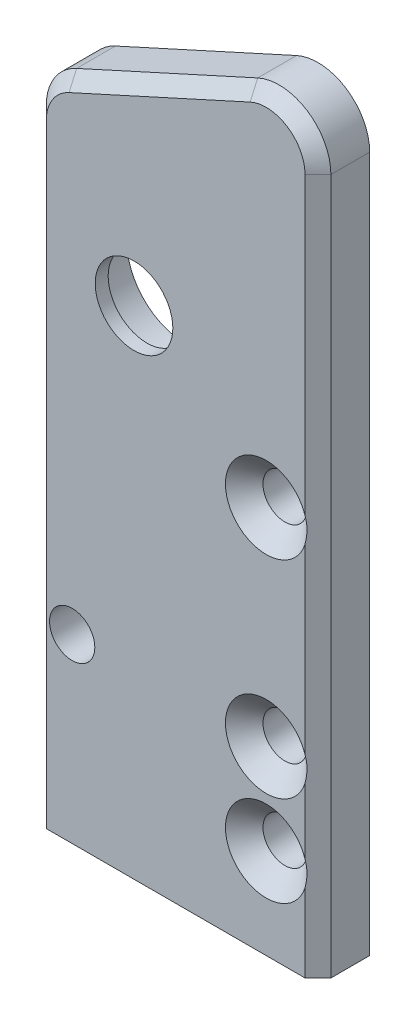
ISO-10303-21;
HEADER;
FILE_DESCRIPTION(('STEP AP214'),'2;1');
FILE_NAME('part.step','',(''),(''),'','','');
FILE_SCHEMA(('AUTOMOTIVE_DESIGN { 1 0 10303 214 1 1 1 1 }'));
ENDSEC;
DATA;
#1=APPLICATION_CONTEXT('core data for automotive mechanical design processes');
#2=APPLICATION_PROTOCOL_DEFINITION('international standard','automotive_design',2000,#1);
#3=PRODUCT_CONTEXT('',#1,'mechanical');
#4=PRODUCT('Part','Part','',(#3));
#5=PRODUCT_RELATED_PRODUCT_CATEGORY('part','',(#4));
#6=PRODUCT_DEFINITION_FORMATION('','',#4);
#7=PRODUCT_DEFINITION_CONTEXT('part definition',#1,'design');
#8=PRODUCT_DEFINITION('design','',#6,#7);
#9=PRODUCT_DEFINITION_SHAPE('','',#8);
#10=(LENGTH_UNIT() NAMED_UNIT(*) SI_UNIT(.MILLI.,.METRE.));
#11=(NAMED_UNIT(*) PLANE_ANGLE_UNIT() SI_UNIT($,.RADIAN.));
#12=(NAMED_UNIT(*) SI_UNIT($,.STERADIAN.) SOLID_ANGLE_UNIT());
#13=UNCERTAINTY_MEASURE_WITH_UNIT(LENGTH_MEASURE(1.E-05),#10,'distance_accuracy_value','');
#14=(GEOMETRIC_REPRESENTATION_CONTEXT(3) GLOBAL_UNCERTAINTY_ASSIGNED_CONTEXT((#13)) GLOBAL_UNIT_ASSIGNED_CONTEXT((#10,
#11,#12)) REPRESENTATION_CONTEXT('',''));
#15=CARTESIAN_POINT('',(0.,0.,0.));
#16=DIRECTION('',(0.,0.,1.));
#17=DIRECTION('',(1.,0.,0.));
#18=AXIS2_PLACEMENT_3D('',#15,#16,#17);
#19=CARTESIAN_POINT('',(7.78086952688254,38.3937133729587,4.));
#20=DIRECTION('',(0.,0.,1.));
#21=DIRECTION('',(1.,0.,0.));
#22=AXIS2_PLACEMENT_3D('',#19,#20,#21);
#23=CYLINDRICAL_SURFACE('',#22,3.);
#24=CARTESIAN_POINT('',(7.78086952688254,38.3937133729587,4.));
#25=DIRECTION('',(0.,0.,1.));
#26=DIRECTION('',(1.,0.,0.));
#27=AXIS2_PLACEMENT_3D('',#24,#25,#26);
#28=CIRCLE('',#27,3.);
#29=CARTESIAN_POINT('',(10.7808695268825,38.3937133729587,4.));
#30=VERTEX_POINT('',#29);
#31=EDGE_CURVE('E199',#30,#30,#28,.T.);
#32=ORIENTED_EDGE('',*,*,#31,.T.);
#33=EDGE_LOOP('',(#32));
#34=FACE_BOUND('',#33,.T.);
#35=CARTESIAN_POINT('',(7.78086952688254,38.3937133729587,3.));
#36=DIRECTION('',(0.,0.,-1.));
#37=DIRECTION('',(-1.,0.,0.));
#38=AXIS2_PLACEMENT_3D('',#35,#36,#37);
#39=CIRCLE('',#38,3.);
#40=CARTESIAN_POINT('',(4.78086952688254,38.3937133729587,3.));
#41=VERTEX_POINT('',#40);
#42=EDGE_CURVE('E46',#41,#41,#39,.F.);
#43=ORIENTED_EDGE('',*,*,#42,.F.);
#44=EDGE_LOOP('',(#43));
#45=FACE_BOUND('',#44,.T.);
#46=ADVANCED_FACE('F41',(#34,#45),#23,.F.);
#47=CARTESIAN_POINT('',(0.,50.,4.));
#48=DIRECTION('',(1.,0.,0.));
#49=DIRECTION('',(0.,1.,0.));
#50=AXIS2_PLACEMENT_3D('',#47,#48,#49);
#51=PLANE('',#50);
#52=DIRECTION('',(0.,0.,-1.));
#53=VECTOR('',#52,1.);
#54=CARTESIAN_POINT('',(0.,0.,4.));
#55=LINE('',#54,#53);
#56=CARTESIAN_POINT('',(0.,0.,2.99999999999999));
#57=VERTEX_POINT('',#56);
#58=CARTESIAN_POINT('',(0.,0.,0.));
#59=VERTEX_POINT('',#58);
#60=EDGE_CURVE('E323',#57,#59,#55,.T.);
#61=ORIENTED_EDGE('',*,*,#60,.F.);
#62=DIRECTION('',(0.,1.,0.));
#63=VECTOR('',#62,1.);
#64=CARTESIAN_POINT('',(0.,47.4243469186929,2.99999999999999));
#65=LINE('',#64,#63);
#66=CARTESIAN_POINT('',(0.,47.4243469186929,2.99999999999999));
#67=VERTEX_POINT('',#66);
#68=EDGE_CURVE('E192',#57,#67,#65,.T.);
#69=ORIENTED_EDGE('',*,*,#68,.T.);
#70=DIRECTION('',(0.,0.,-1.));
#71=VECTOR('',#70,1.);
#72=CARTESIAN_POINT('',(0.,47.4243469186929,4.));
#73=LINE('',#72,#71);
#74=CARTESIAN_POINT('',(0.,47.4243469186929,0.));
#75=VERTEX_POINT('',#74);
#76=EDGE_CURVE('E320',#67,#75,#73,.T.);
#77=ORIENTED_EDGE('',*,*,#76,.T.);
#78=DIRECTION('',(0.,-1.,0.));
#79=VECTOR('',#78,1.);
#80=CARTESIAN_POINT('',(0.,50.,0.));
#81=LINE('',#80,#79);
#82=EDGE_CURVE('E211',#75,#59,#81,.T.);
#83=ORIENTED_EDGE('',*,*,#82,.T.);
#84=EDGE_LOOP('',(#61,#69,#77,#83));
#85=FACE_BOUND('',#84,.T.);
#86=ADVANCED_FACE('F242',(#85),#51,.F.);
#87=CARTESIAN_POINT('',(0.,0.,4.));
#88=DIRECTION('',(0.,1.,0.));
#89=DIRECTION('',(0.,0.,1.));
#90=AXIS2_PLACEMENT_3D('',#87,#88,#89);
#91=PLANE('',#90);
#92=CARTESIAN_POINT('',(4.,0.,2.));
#93=DIRECTION('',(0.,-1.,0.));
#94=DIRECTION('',(0.,0.,-1.));
#95=AXIS2_PLACEMENT_3D('',#92,#93,#94);
#96=CIRCLE('',#95,0.799999999999999);
#97=CARTESIAN_POINT('',(4.,0.,1.2));
#98=VERTEX_POINT('',#97);
#99=EDGE_CURVE('E383',#98,#98,#96,.T.);
#100=ORIENTED_EDGE('',*,*,#99,.F.);
#101=EDGE_LOOP('',(#100));
#102=FACE_BOUND('',#101,.T.);
#103=CARTESIAN_POINT('',(12.,0.,2.));
#104=DIRECTION('',(0.,-1.,0.));
#105=DIRECTION('',(0.,0.,-1.));
#106=AXIS2_PLACEMENT_3D('',#103,#104,#105);
#107=CIRCLE('',#106,0.799999999999999);
#108=CARTESIAN_POINT('',(12.,0.,1.2));
#109=VERTEX_POINT('',#108);
#110=EDGE_CURVE('E375',#109,#109,#107,.T.);
#111=ORIENTED_EDGE('',*,*,#110,.F.);
#112=EDGE_LOOP('',(#111));
#113=FACE_BOUND('',#112,.T.);
#114=DIRECTION('',(0.,0.,-1.));
#115=VECTOR('',#114,1.);
#116=CARTESIAN_POINT('',(22.,0.,4.));
#117=LINE('',#116,#115);
#118=CARTESIAN_POINT('',(22.,0.,2.99999999999999));
#119=VERTEX_POINT('',#118);
#120=CARTESIAN_POINT('',(22.,0.,0.));
#121=VERTEX_POINT('',#120);
#122=EDGE_CURVE('E326',#119,#121,#117,.T.);
#123=ORIENTED_EDGE('',*,*,#122,.F.);
#124=DIRECTION('',(-0.707106781186545,0.,0.70710678118655));
#125=VECTOR('',#124,1.);
#126=CARTESIAN_POINT('',(21.,0.,4.));
#127=LINE('',#126,#125);
#128=CARTESIAN_POINT('',(21.,0.,4.));
#129=VERTEX_POINT('',#128);
#130=EDGE_CURVE('E178',#119,#129,#127,.T.);
#131=ORIENTED_EDGE('',*,*,#130,.T.);
#132=DIRECTION('',(1.,0.,0.));
#133=VECTOR('',#132,1.);
#134=CARTESIAN_POINT('',(0.,0.,4.));
#135=LINE('',#134,#133);
#136=CARTESIAN_POINT('',(1.,0.,4.));
#137=VERTEX_POINT('',#136);
#138=EDGE_CURVE('E329',#137,#129,#135,.T.);
#139=ORIENTED_EDGE('',*,*,#138,.F.);
#140=DIRECTION('',(-0.707106781186545,0.,-0.70710678118655));
#141=VECTOR('',#140,1.);
#142=CARTESIAN_POINT('',(1.,0.,4.));
#143=LINE('',#142,#141);
#144=EDGE_CURVE('E173',#137,#57,#143,.T.);
#145=ORIENTED_EDGE('',*,*,#144,.T.);
#146=ORIENTED_EDGE('',*,*,#60,.T.);
#147=DIRECTION('',(1.,0.,0.));
#148=VECTOR('',#147,1.);
#149=CARTESIAN_POINT('',(0.,0.,0.));
#150=LINE('',#149,#148);
#151=EDGE_CURVE('E337',#59,#121,#150,.T.);
#152=ORIENTED_EDGE('',*,*,#151,.T.);
#153=EDGE_LOOP('',(#123,#131,#139,#145,#146,#152));
#154=FACE_BOUND('',#153,.T.);
#155=ADVANCED_FACE('F259',(#102,#113,#154),#91,.F.);
#156=CARTESIAN_POINT('',(22.,0.,4.));
#157=DIRECTION('',(-1.,0.,0.));
#158=DIRECTION('',(0.,0.,1.));
#159=AXIS2_PLACEMENT_3D('',#156,#157,#158);
#160=PLANE('',#159);
#161=DIRECTION('',(0.,0.,-1.));
#162=VECTOR('',#161,1.);
#163=CARTESIAN_POINT('',(22.,53.7879832823292,4.));
#164=LINE('',#163,#162);
#165=CARTESIAN_POINT('',(22.,53.7879832823292,0.));
#166=VERTEX_POINT('',#165);
#167=CARTESIAN_POINT('',(22.,53.7879832823292,2.99999999999999));
#168=VERTEX_POINT('',#167);
#169=EDGE_CURVE('E308',#166,#168,#164,.F.);
#170=ORIENTED_EDGE('',*,*,#169,.T.);
#171=DIRECTION('',(0.,-1.,0.));
#172=VECTOR('',#171,1.);
#173=CARTESIAN_POINT('',(22.,0.,2.99999999999999));
#174=LINE('',#173,#172);
#175=EDGE_CURVE('E169',#168,#119,#174,.T.);
#176=ORIENTED_EDGE('',*,*,#175,.T.);
#177=ORIENTED_EDGE('',*,*,#122,.T.);
#178=DIRECTION('',(0.,1.,0.));
#179=VECTOR('',#178,1.);
#180=CARTESIAN_POINT('',(22.,0.,0.));
#181=LINE('',#180,#179);
#182=EDGE_CURVE('E333',#121,#166,#181,.T.);
#183=ORIENTED_EDGE('',*,*,#182,.T.);
#184=EDGE_LOOP('',(#170,#176,#177,#183));
#185=FACE_BOUND('',#184,.T.);
#186=ADVANCED_FACE('F255',(#185),#160,.F.);
#187=CARTESIAN_POINT('',(22.,60.,4.));
#188=DIRECTION('',(0.413802944301184,-0.910366477462605,0.));
#189=DIRECTION('',(0.910366477462605,0.413802944301184,0.));
#190=AXIS2_PLACEMENT_3D('',#187,#188,#189);
#191=PLANE('',#190);
#192=DIRECTION('',(0.,0.,-1.));
#193=VECTOR('',#192,1.);
#194=CARTESIAN_POINT('',(2.34478822279527,51.0658128285433,4.));
#195=LINE('',#194,#193);
#196=CARTESIAN_POINT('',(2.34478822279527,51.0658128285433,0.));
#197=VERTEX_POINT('',#196);
#198=CARTESIAN_POINT('',(2.34478822279527,51.0658128285433,2.99999999999999));
#199=VERTEX_POINT('',#198);
#200=EDGE_CURVE('E286',#197,#199,#195,.F.);
#201=ORIENTED_EDGE('',*,*,#200,.T.);
#202=DIRECTION('',(0.910366477462605,0.413802944301184,0.));
#203=VECTOR('',#202,1.);
#204=CARTESIAN_POINT('',(16.3447882227953,57.4294491921797,2.99999999999999));
#205=LINE('',#204,#203);
#206=CARTESIAN_POINT('',(16.3447882227953,57.4294491921797,2.99999999999999));
#207=VERTEX_POINT('',#206);
#208=EDGE_CURVE('E186',#199,#207,#205,.T.);
#209=ORIENTED_EDGE('',*,*,#208,.T.);
#210=DIRECTION('',(0.,0.,-1.));
#211=VECTOR('',#210,1.);
#212=CARTESIAN_POINT('',(16.3447882227953,57.4294491921797,4.));
#213=LINE('',#212,#211);
#214=CARTESIAN_POINT('',(16.3447882227953,57.4294491921797,0.));
#215=VERTEX_POINT('',#214);
#216=EDGE_CURVE('E278',#207,#215,#213,.T.);
#217=ORIENTED_EDGE('',*,*,#216,.T.);
#218=DIRECTION('',(-0.910366477462605,-0.413802944301184,0.));
#219=VECTOR('',#218,1.);
#220=CARTESIAN_POINT('',(22.,60.,0.));
#221=LINE('',#220,#219);
#222=EDGE_CURVE('E330',#215,#197,#221,.T.);
#223=ORIENTED_EDGE('',*,*,#222,.T.);
#224=EDGE_LOOP('',(#201,#209,#217,#223));
#225=FACE_BOUND('',#224,.T.);
#226=ADVANCED_FACE('F247',(#225),#191,.F.);
#227=CARTESIAN_POINT('',(0.,0.,4.));
#228=DIRECTION('',(0.,0.,1.));
#229=DIRECTION('',(1.,0.,0.));
#230=AXIS2_PLACEMENT_3D('',#227,#228,#229);
#231=PLANE('',#230);
#232=CARTESIAN_POINT('',(3.,14.,4.));
#233=DIRECTION('',(0.,0.,1.));
#234=DIRECTION('',(1.,0.,0.));
#235=AXIS2_PLACEMENT_3D('',#232,#233,#234);
#236=CIRCLE('',#235,1.75);
#237=CARTESIAN_POINT('',(4.75,14.,4.));
#238=VERTEX_POINT('',#237);
#239=EDGE_CURVE('E406',#238,#238,#236,.T.);
#240=ORIENTED_EDGE('',*,*,#239,.F.);
#241=EDGE_LOOP('',(#240));
#242=FACE_BOUND('',#241,.T.);
#243=CARTESIAN_POINT('',(18.,30.,4.));
#244=DIRECTION('',(0.,0.,1.));
#245=DIRECTION('',(1.,0.,0.));
#246=AXIS2_PLACEMENT_3D('',#243,#244,#245);
#247=CIRCLE('',#246,3.15);
#248=CARTESIAN_POINT('',(21.,30.9604686356149,4.));
#249=VERTEX_POINT('',#248);
#250=CARTESIAN_POINT('',(21.,29.0395313643851,4.));
#251=VERTEX_POINT('',#250);
#252=EDGE_CURVE('E57',#249,#251,#247,.T.);
#253=ORIENTED_EDGE('',*,*,#252,.F.);
#254=DIRECTION('',(0.,1.,0.));
#255=VECTOR('',#254,1.);
#256=CARTESIAN_POINT('',(21.,53.7879832823292,4.));
#257=LINE('',#256,#255);
#258=CARTESIAN_POINT('',(21.,53.7879832823292,4.));
#259=VERTEX_POINT('',#258);
#260=EDGE_CURVE('E144',#249,#259,#257,.T.);
#261=ORIENTED_EDGE('',*,*,#260,.T.);
#262=CARTESIAN_POINT('',(18.,53.7879832823292,4.));
#263=DIRECTION('',(0.,0.,1.));
#264=DIRECTION('',(1.,0.,0.));
#265=AXIS2_PLACEMENT_3D('',#262,#263,#264);
#266=CIRCLE('',#265,3.);
#267=CARTESIAN_POINT('',(16.7585911670964,56.5190827147171,4.));
#268=VERTEX_POINT('',#267);
#269=EDGE_CURVE('E157',#259,#268,#266,.T.);
#270=ORIENTED_EDGE('',*,*,#269,.T.);
#271=DIRECTION('',(-0.910366477462605,-0.413802944301184,0.));
#272=VECTOR('',#271,1.);
#273=CARTESIAN_POINT('',(2.75859116709645,50.1554463510807,4.));
#274=LINE('',#273,#272);
#275=CARTESIAN_POINT('',(2.75859116709645,50.1554463510807,4.));
#276=VERTEX_POINT('',#275);
#277=EDGE_CURVE('E163',#268,#276,#274,.T.);
#278=ORIENTED_EDGE('',*,*,#277,.T.);
#279=CARTESIAN_POINT('',(4.,47.4243469186929,4.));
#280=DIRECTION('',(0.,0.,1.));
#281=DIRECTION('',(1.,0.,0.));
#282=AXIS2_PLACEMENT_3D('',#279,#280,#281);
#283=CIRCLE('',#282,3.);
#284=CARTESIAN_POINT('',(1.,47.4243469186929,4.));
#285=VERTEX_POINT('',#284);
#286=EDGE_CURVE('E296',#276,#285,#283,.T.);
#287=ORIENTED_EDGE('',*,*,#286,.T.);
#288=DIRECTION('',(0.,-1.,0.));
#289=VECTOR('',#288,1.);
#290=CARTESIAN_POINT('',(1.,0.,4.));
#291=LINE('',#290,#289);
#292=EDGE_CURVE('E305',#285,#137,#291,.T.);
#293=ORIENTED_EDGE('',*,*,#292,.T.);
#294=ORIENTED_EDGE('',*,*,#138,.T.);
#295=CARTESIAN_POINT('',(21.,6.03953136438507,4.));
#296=VERTEX_POINT('',#295);
#297=EDGE_CURVE('E160',#129,#296,#257,.T.);
#298=ORIENTED_EDGE('',*,*,#297,.T.);
#299=CARTESIAN_POINT('',(18.,7.,4.));
#300=DIRECTION('',(0.,0.,1.));
#301=DIRECTION('',(1.,0.,0.));
#302=AXIS2_PLACEMENT_3D('',#299,#300,#301);
#303=CIRCLE('',#302,3.15);
#304=CARTESIAN_POINT('',(21.,7.96046863561493,4.));
#305=VERTEX_POINT('',#304);
#306=EDGE_CURVE('E64',#305,#296,#303,.T.);
#307=ORIENTED_EDGE('',*,*,#306,.F.);
#308=CARTESIAN_POINT('',(21.,13.0395313643851,4.));
#309=VERTEX_POINT('',#308);
#310=EDGE_CURVE('E159',#305,#309,#257,.T.);
#311=ORIENTED_EDGE('',*,*,#310,.T.);
#312=CARTESIAN_POINT('',(18.,14.,4.));
#313=DIRECTION('',(0.,0.,1.));
#314=DIRECTION('',(1.,0.,0.));
#315=AXIS2_PLACEMENT_3D('',#312,#313,#314);
#316=CIRCLE('',#315,3.15);
#317=CARTESIAN_POINT('',(21.,14.9604686356149,4.));
#318=VERTEX_POINT('',#317);
#319=EDGE_CURVE('E357',#318,#309,#316,.T.);
#320=ORIENTED_EDGE('',*,*,#319,.F.);
#321=EDGE_CURVE('E147',#318,#251,#257,.T.);
#322=ORIENTED_EDGE('',*,*,#321,.T.);
#323=EDGE_LOOP('',(#253,#261,#270,#278,#287,#293,#294,#298,#307,#311,#320,#322));
#324=FACE_BOUND('',#323,.T.);
#325=ORIENTED_EDGE('',*,*,#31,.F.);
#326=EDGE_LOOP('',(#325));
#327=FACE_BOUND('',#326,.T.);
#328=ADVANCED_FACE('F142',(#242,#324,#327),#231,.T.);
#329=CARTESIAN_POINT('',(0.,0.,0.));
#330=DIRECTION('',(0.,0.,1.));
#331=DIRECTION('',(1.,0.,0.));
#332=AXIS2_PLACEMENT_3D('',#329,#330,#331);
#333=PLANE('',#332);
#334=CARTESIAN_POINT('',(3.,14.,0.));
#335=DIRECTION('',(0.,0.,1.));
#336=DIRECTION('',(1.,0.,0.));
#337=AXIS2_PLACEMENT_3D('',#334,#335,#336);
#338=CIRCLE('',#337,1.75);
#339=CARTESIAN_POINT('',(4.75,14.,0.));
#340=VERTEX_POINT('',#339);
#341=EDGE_CURVE('E399',#340,#340,#338,.T.);
#342=ORIENTED_EDGE('',*,*,#341,.T.);
#343=EDGE_LOOP('',(#342));
#344=FACE_BOUND('',#343,.T.);
#345=CARTESIAN_POINT('',(7.78086952688254,38.3937133729587,0.));
#346=DIRECTION('',(0.,0.,-1.));
#347=DIRECTION('',(-1.,0.,0.));
#348=AXIS2_PLACEMENT_3D('',#345,#346,#347);
#349=CIRCLE('',#348,4.55);
#350=CARTESIAN_POINT('',(3.23086952688254,38.3937133729587,0.));
#351=VERTEX_POINT('',#350);
#352=EDGE_CURVE('E394',#351,#351,#349,.T.);
#353=ORIENTED_EDGE('',*,*,#352,.F.);
#354=EDGE_LOOP('',(#353));
#355=FACE_BOUND('',#354,.T.);
#356=CARTESIAN_POINT('',(18.,30.,0.));
#357=DIRECTION('',(0.,0.,1.));
#358=DIRECTION('',(1.,0.,0.));
#359=AXIS2_PLACEMENT_3D('',#356,#357,#358);
#360=CIRCLE('',#359,1.7);
#361=CARTESIAN_POINT('',(19.7,30.,0.));
#362=VERTEX_POINT('',#361);
#363=EDGE_CURVE('E387',#362,#362,#360,.T.);
#364=ORIENTED_EDGE('',*,*,#363,.T.);
#365=EDGE_LOOP('',(#364));
#366=FACE_BOUND('',#365,.T.);
#367=CARTESIAN_POINT('',(18.,7.,0.));
#368=DIRECTION('',(0.,0.,1.));
#369=DIRECTION('',(1.,0.,0.));
#370=AXIS2_PLACEMENT_3D('',#367,#368,#369);
#371=CIRCLE('',#370,1.7);
#372=CARTESIAN_POINT('',(19.7,7.,0.));
#373=VERTEX_POINT('',#372);
#374=EDGE_CURVE('E361',#373,#373,#371,.T.);
#375=ORIENTED_EDGE('',*,*,#374,.T.);
#376=EDGE_LOOP('',(#375));
#377=FACE_BOUND('',#376,.T.);
#378=CARTESIAN_POINT('',(18.,14.,0.));
#379=DIRECTION('',(0.,0.,1.));
#380=DIRECTION('',(1.,0.,0.));
#381=AXIS2_PLACEMENT_3D('',#378,#379,#380);
#382=CIRCLE('',#381,1.7);
#383=CARTESIAN_POINT('',(19.7,14.,0.));
#384=VERTEX_POINT('',#383);
#385=EDGE_CURVE('E349',#384,#384,#382,.T.);
#386=ORIENTED_EDGE('',*,*,#385,.T.);
#387=EDGE_LOOP('',(#386));
#388=FACE_BOUND('',#387,.T.);
#389=ORIENTED_EDGE('',*,*,#82,.F.);
#390=CARTESIAN_POINT('',(4.,47.4243469186929,0.));
#391=DIRECTION('',(0.,0.,1.));
#392=DIRECTION('',(1.,0.,0.));
#393=AXIS2_PLACEMENT_3D('',#390,#391,#392);
#394=CIRCLE('',#393,4.);
#395=EDGE_CURVE('E287',#75,#197,#394,.F.);
#396=ORIENTED_EDGE('',*,*,#395,.T.);
#397=ORIENTED_EDGE('',*,*,#222,.F.);
#398=CARTESIAN_POINT('',(18.,53.7879832823292,0.));
#399=DIRECTION('',(0.,0.,1.));
#400=DIRECTION('',(1.,0.,0.));
#401=AXIS2_PLACEMENT_3D('',#398,#399,#400);
#402=CIRCLE('',#401,4.);
#403=EDGE_CURVE('E282',#215,#166,#402,.F.);
#404=ORIENTED_EDGE('',*,*,#403,.T.);
#405=ORIENTED_EDGE('',*,*,#182,.F.);
#406=ORIENTED_EDGE('',*,*,#151,.F.);
#407=EDGE_LOOP('',(#389,#396,#397,#404,#405,#406));
#408=FACE_BOUND('',#407,.T.);
#409=ADVANCED_FACE('F246',(#344,#355,#366,#377,#388,#408),#333,.F.);
#410=CARTESIAN_POINT('',(4.,47.4243469186929,4.));
#411=DIRECTION('',(0.,0.,-1.));
#412=DIRECTION('',(-1.,0.,0.));
#413=AXIS2_PLACEMENT_3D('',#410,#411,#412);
#414=CYLINDRICAL_SURFACE('',#413,4.);
#415=ORIENTED_EDGE('',*,*,#76,.F.);
#416=CARTESIAN_POINT('',(4.,47.4243469186929,2.99999999999999));
#417=DIRECTION('',(0.,0.,1.));
#418=DIRECTION('',(1.,0.,0.));
#419=AXIS2_PLACEMENT_3D('',#416,#417,#418);
#420=CIRCLE('',#419,4.);
#421=EDGE_CURVE('E189',#67,#199,#420,.F.);
#422=ORIENTED_EDGE('',*,*,#421,.T.);
#423=ORIENTED_EDGE('',*,*,#200,.F.);
#424=ORIENTED_EDGE('',*,*,#395,.F.);
#425=EDGE_LOOP('',(#415,#422,#423,#424));
#426=FACE_BOUND('',#425,.T.);
#427=ADVANCED_FACE('F251',(#426),#414,.T.);
#428=CARTESIAN_POINT('',(18.,53.7879832823292,4.));
#429=DIRECTION('',(0.,0.,-1.));
#430=DIRECTION('',(-1.,0.,0.));
#431=AXIS2_PLACEMENT_3D('',#428,#429,#430);
#432=CYLINDRICAL_SURFACE('',#431,4.);
#433=ORIENTED_EDGE('',*,*,#216,.F.);
#434=CARTESIAN_POINT('',(18.,53.7879832823292,2.99999999999999));
#435=DIRECTION('',(0.,0.,1.));
#436=DIRECTION('',(1.,0.,0.));
#437=AXIS2_PLACEMENT_3D('',#434,#435,#436);
#438=CIRCLE('',#437,4.);
#439=EDGE_CURVE('E183',#207,#168,#438,.F.);
#440=ORIENTED_EDGE('',*,*,#439,.T.);
#441=ORIENTED_EDGE('',*,*,#169,.F.);
#442=ORIENTED_EDGE('',*,*,#403,.F.);
#443=EDGE_LOOP('',(#433,#440,#441,#442));
#444=FACE_BOUND('',#443,.T.);
#445=ADVANCED_FACE('F267',(#444),#432,.T.);
#446=CARTESIAN_POINT('',(1.,0.,4.));
#447=DIRECTION('',(-0.70710678118655,0.,0.707106781186545));
#448=DIRECTION('',(0.,1.,0.));
#449=AXIS2_PLACEMENT_3D('',#446,#447,#448);
#450=PLANE('',#449);
#451=ORIENTED_EDGE('',*,*,#144,.F.);
#452=ORIENTED_EDGE('',*,*,#292,.F.);
#453=DIRECTION('',(0.707106781186545,0.,0.70710678118655));
#454=VECTOR('',#453,1.);
#455=CARTESIAN_POINT('',(0.,47.4243469186929,2.99999999999999));
#456=LINE('',#455,#454);
#457=EDGE_CURVE('E207',#67,#285,#456,.T.);
#458=ORIENTED_EDGE('',*,*,#457,.F.);
#459=ORIENTED_EDGE('',*,*,#68,.F.);
#460=EDGE_LOOP('',(#451,#452,#458,#459));
#461=FACE_BOUND('',#460,.T.);
#462=ADVANCED_FACE('F44',(#461),#450,.T.);
#463=CARTESIAN_POINT('',(4.,47.4243469186929,4.));
#464=DIRECTION('',(0.,0.,-1.));
#465=DIRECTION('',(-1.,0.,0.));
#466=AXIS2_PLACEMENT_3D('',#463,#464,#465);
#467=CONICAL_SURFACE('',#466,3.,0.785398163397445);
#468=ORIENTED_EDGE('',*,*,#457,.T.);
#469=ORIENTED_EDGE('',*,*,#286,.F.);
#470=DIRECTION('',(0.292602867990325,-0.643726309578716,0.70710678118655));
#471=VECTOR('',#470,1.);
#472=CARTESIAN_POINT('',(2.34478822279527,51.0658128285433,2.99999999999999));
#473=LINE('',#472,#471);
#474=EDGE_CURVE('E203',#199,#276,#473,.T.);
#475=ORIENTED_EDGE('',*,*,#474,.F.);
#476=ORIENTED_EDGE('',*,*,#421,.F.);
#477=EDGE_LOOP('',(#468,#469,#475,#476));
#478=FACE_BOUND('',#477,.T.);
#479=ADVANCED_FACE('F274',(#478),#467,.T.);
#480=CARTESIAN_POINT('',(-18.421813494055,40.527989686921,4.));
#481=DIRECTION('',(-0.292602867990326,0.643726309578718,0.707106781186547));
#482=DIRECTION('',(0.910366477462605,0.413802944301184,0.));
#483=AXIS2_PLACEMENT_3D('',#480,#481,#482);
#484=PLANE('',#483);
#485=ORIENTED_EDGE('',*,*,#474,.T.);
#486=ORIENTED_EDGE('',*,*,#277,.F.);
#487=DIRECTION('',(0.292602867990326,-0.643726309578719,0.707106781186547));
#488=VECTOR('',#487,1.);
#489=CARTESIAN_POINT('',(16.3447882227953,57.4294491921797,2.99999999999999));
#490=LINE('',#489,#488);
#491=EDGE_CURVE('E198',#207,#268,#490,.T.);
#492=ORIENTED_EDGE('',*,*,#491,.F.);
#493=ORIENTED_EDGE('',*,*,#208,.F.);
#494=EDGE_LOOP('',(#485,#486,#492,#493));
#495=FACE_BOUND('',#494,.T.);
#496=ADVANCED_FACE('F292',(#495),#484,.T.);
#497=CARTESIAN_POINT('',(18.,53.7879832823292,4.));
#498=DIRECTION('',(0.,0.,-1.));
#499=DIRECTION('',(-1.,0.,0.));
#500=AXIS2_PLACEMENT_3D('',#497,#498,#499);
#501=CONICAL_SURFACE('',#500,3.,0.785398163397445);
#502=ORIENTED_EDGE('',*,*,#491,.T.);
#503=ORIENTED_EDGE('',*,*,#269,.F.);
#504=DIRECTION('',(-0.707106781186545,0.,0.70710678118655));
#505=VECTOR('',#504,1.);
#506=CARTESIAN_POINT('',(22.,53.7879832823292,2.99999999999999));
#507=LINE('',#506,#505);
#508=EDGE_CURVE('E154',#168,#259,#507,.T.);
#509=ORIENTED_EDGE('',*,*,#508,.F.);
#510=ORIENTED_EDGE('',*,*,#439,.F.);
#511=EDGE_LOOP('',(#502,#503,#509,#510));
#512=FACE_BOUND('',#511,.T.);
#513=ADVANCED_FACE('F294',(#512),#501,.T.);
#514=CARTESIAN_POINT('',(21.,0.,4.));
#515=DIRECTION('',(0.70710678118655,0.,0.707106781186545));
#516=DIRECTION('',(0.,-1.,0.));
#517=AXIS2_PLACEMENT_3D('',#514,#515,#516);
#518=PLANE('',#517);
#519=CARTESIAN_POINT('',(20.9998,29.038251592151,4.0002));
#520=CARTESIAN_POINT('',(21.0094598288719,29.1000168735679,3.99054017112806));
#521=CARTESIAN_POINT('',(21.0182296806067,29.1620545345121,3.98177031939328));
#522=CARTESIAN_POINT('',(21.0339377036715,29.2865969080283,3.96606229632847));
#523=CARTESIAN_POINT('',(21.0408757204833,29.3491016595431,3.9591242795167));
#524=CARTESIAN_POINT('',(21.0588655060921,29.5372189299875,3.9411344939079));
#525=CARTESIAN_POINT('',(21.0670876099148,29.6634002173136,3.93291239008519));
#526=CARTESIAN_POINT('',(21.0756519317253,29.9139743858808,3.92434806827473));
#527=CARTESIAN_POINT('',(21.0761349807796,30.0383579677483,3.92386501922042));
#528=CARTESIAN_POINT('',(21.0695708497944,30.2866598549277,3.93042915020556));
#529=CARTESIAN_POINT('',(21.0625286153051,30.4105784121721,3.93747138469494));
#530=CARTESIAN_POINT('',(21.0456109780022,30.6054996769846,3.95438902199784));
#531=CARTESIAN_POINT('',(21.0381550522407,30.6769419447855,3.96184494775925));
#532=CARTESIAN_POINT('',(21.0207993090742,30.8196284386953,3.97920069092582));
#533=CARTESIAN_POINT('',(21.0108865057673,30.8908695095365,3.98911349423269));
#534=CARTESIAN_POINT('',(20.9997999999999,30.9617484078498,4.00020000000012));
#535=B_SPLINE_CURVE_WITH_KNOTS('',3,(#519,#520,#521,#522,#523,#524,#525,#526,#527,#528,#529,
#530,#531,#532,#533,#534),.UNSPECIFIED.,.F.,.F.,(4,2,2,2,2,2,2,4),(0.,0.189747818518311,
0.379511637462911,0.759144204728139,1.13186041624852,1.5043318325143,1.72090674911368,
1.93865174773794),.UNSPECIFIED.);
#536=EDGE_CURVE('E11',#251,#249,#535,.T.);
#537=ORIENTED_EDGE('',*,*,#536,.F.);
#538=ORIENTED_EDGE('',*,*,#321,.F.);
#539=CARTESIAN_POINT('',(20.9998,13.038251592151,4.0002));
#540=CARTESIAN_POINT('',(21.0094598288719,13.1000168735679,3.99054017112806));
#541=CARTESIAN_POINT('',(21.0182296806067,13.1620545345121,3.98177031939328));
#542=CARTESIAN_POINT('',(21.0339377036715,13.2865969080283,3.96606229632848));
#543=CARTESIAN_POINT('',(21.0408757204833,13.3491016595431,3.9591242795167));
#544=CARTESIAN_POINT('',(21.0588655060921,13.5372189299875,3.9411344939079));
#545=CARTESIAN_POINT('',(21.0670876099148,13.6634002173136,3.93291239008519));
#546=CARTESIAN_POINT('',(21.0756519317253,13.9139743858809,3.92434806827473));
#547=CARTESIAN_POINT('',(21.0761349807796,14.0383579677483,3.92386501922042));
#548=CARTESIAN_POINT('',(21.0695708497944,14.2866598549277,3.93042915020556));
#549=CARTESIAN_POINT('',(21.0625286153051,14.4105784121721,3.93747138469494));
#550=CARTESIAN_POINT('',(21.0456109780022,14.6054996769845,3.95438902199783));
#551=CARTESIAN_POINT('',(21.0381550522408,14.6769419447853,3.96184494775923));
#552=CARTESIAN_POINT('',(21.0207993090742,14.8196284386948,3.97920069092576));
#553=CARTESIAN_POINT('',(21.0108865057674,14.890869509536,3.98911349423261));
#554=CARTESIAN_POINT('',(20.9998,14.9617484078491,4.00020000000002));
#555=B_SPLINE_CURVE_WITH_KNOTS('',3,(#539,#540,#541,#542,#543,#544,#545,#546,#547,#548,#549,
#550,#551,#552,#553,#554),.UNSPECIFIED.,.F.,.F.,(4,2,2,2,2,2,2,4),(0.,0.189747818518309,
0.379511637462907,0.759144204728137,1.13186041624852,1.50433183251431,1.72090674911334,
1.93865174773725),.UNSPECIFIED.);
#556=EDGE_CURVE('E195',#309,#318,#555,.T.);
#557=ORIENTED_EDGE('',*,*,#556,.F.);
#558=ORIENTED_EDGE('',*,*,#310,.F.);
#559=CARTESIAN_POINT('',(20.9998,6.03825159215105,4.0002));
#560=CARTESIAN_POINT('',(21.0094598288719,6.10001687356788,3.99054017112806));
#561=CARTESIAN_POINT('',(21.0182296806067,6.16205453451211,3.98177031939328));
#562=CARTESIAN_POINT('',(21.0339377036715,6.2865969080283,3.96606229632847));
#563=CARTESIAN_POINT('',(21.0408757204833,6.3491016595431,3.9591242795167));
#564=CARTESIAN_POINT('',(21.0588655060921,6.5372189299875,3.9411344939079));
#565=CARTESIAN_POINT('',(21.0670876099148,6.66340021731363,3.93291239008519));
#566=CARTESIAN_POINT('',(21.0756519317253,6.91397438588086,3.92434806827473));
#567=CARTESIAN_POINT('',(21.0761349807796,7.03835796774829,3.92386501922042));
#568=CARTESIAN_POINT('',(21.0695708497944,7.2866598549277,3.93042915020556));
#569=CARTESIAN_POINT('',(21.0625286153051,7.41057841217211,3.93747138469494));
#570=CARTESIAN_POINT('',(21.0456109780022,7.60549967698448,3.95438902199783));
#571=CARTESIAN_POINT('',(21.0381550522408,7.67694194478528,3.96184494775923));
#572=CARTESIAN_POINT('',(21.0207993090742,7.81962843869481,3.97920069092576));
#573=CARTESIAN_POINT('',(21.0108865057674,7.89086950953598,3.98911349423261));
#574=CARTESIAN_POINT('',(20.9998,7.96174840784908,4.00020000000002));
#575=B_SPLINE_CURVE_WITH_KNOTS('',3,(#559,#560,#561,#562,#563,#564,#565,#566,#567,#568,#569,
#570,#571,#572,#573,#574),.UNSPECIFIED.,.F.,.F.,(4,2,2,2,2,2,2,4),(0.,0.189747818518312,
0.379511637462911,0.759144204728138,1.13186041624852,1.50433183251431,1.72090674911334,
1.93865174773725),.UNSPECIFIED.);
#576=EDGE_CURVE('E52',#296,#305,#575,.T.);
#577=ORIENTED_EDGE('',*,*,#576,.F.);
#578=ORIENTED_EDGE('',*,*,#297,.F.);
#579=ORIENTED_EDGE('',*,*,#130,.F.);
#580=ORIENTED_EDGE('',*,*,#175,.F.);
#581=ORIENTED_EDGE('',*,*,#508,.T.);
#582=ORIENTED_EDGE('',*,*,#260,.F.);
#583=EDGE_LOOP('',(#537,#538,#557,#558,#577,#578,#579,#580,#581,#582));
#584=FACE_BOUND('',#583,.T.);
#585=ADVANCED_FACE('F151',(#584),#518,.T.);
#586=CARTESIAN_POINT('',(18.,14.,4.));
#587=DIRECTION('',(0.,0.,1.));
#588=DIRECTION('',(1.,0.,0.));
#589=AXIS2_PLACEMENT_3D('',#586,#587,#588);
#590=CYLINDRICAL_SURFACE('',#589,1.7);
#591=ORIENTED_EDGE('',*,*,#385,.F.);
#592=EDGE_LOOP('',(#591));
#593=FACE_BOUND('',#592,.T.);
#594=CARTESIAN_POINT('',(18.,14.,2.55));
#595=DIRECTION('',(0.,0.,1.));
#596=DIRECTION('',(1.,0.,0.));
#597=AXIS2_PLACEMENT_3D('',#594,#595,#596);
#598=CIRCLE('',#597,1.7);
#599=CARTESIAN_POINT('',(19.7,14.,2.55));
#600=VERTEX_POINT('',#599);
#601=EDGE_CURVE('E353',#600,#600,#598,.T.);
#602=ORIENTED_EDGE('',*,*,#601,.T.);
#603=EDGE_LOOP('',(#602));
#604=FACE_BOUND('',#603,.T.);
#605=ADVANCED_FACE('F235',(#593,#604),#590,.F.);
#606=CARTESIAN_POINT('',(18.,14.,4.));
#607=DIRECTION('',(0.,0.,1.));
#608=DIRECTION('',(1.,0.,0.));
#609=AXIS2_PLACEMENT_3D('',#606,#607,#608);
#610=CONICAL_SURFACE('',#609,3.15,0.785398163397449);
#611=ORIENTED_EDGE('',*,*,#556,.T.);
#612=ORIENTED_EDGE('',*,*,#319,.T.);
#613=EDGE_LOOP('',(#611,#612));
#614=FACE_BOUND('',#613,.T.);
#615=ORIENTED_EDGE('',*,*,#601,.F.);
#616=EDGE_LOOP('',(#615));
#617=FACE_BOUND('',#616,.T.);
#618=ADVANCED_FACE('F229',(#614,#617),#610,.F.);
#619=CARTESIAN_POINT('',(18.,7.,4.));
#620=DIRECTION('',(0.,0.,1.));
#621=DIRECTION('',(1.,0.,0.));
#622=AXIS2_PLACEMENT_3D('',#619,#620,#621);
#623=CYLINDRICAL_SURFACE('',#622,1.7);
#624=ORIENTED_EDGE('',*,*,#374,.F.);
#625=EDGE_LOOP('',(#624));
#626=FACE_BOUND('',#625,.T.);
#627=CARTESIAN_POINT('',(18.,7.,2.55));
#628=DIRECTION('',(0.,0.,1.));
#629=DIRECTION('',(1.,0.,0.));
#630=AXIS2_PLACEMENT_3D('',#627,#628,#629);
#631=CIRCLE('',#630,1.7);
#632=CARTESIAN_POINT('',(19.7,7.,2.55));
#633=VERTEX_POINT('',#632);
#634=EDGE_CURVE('E365',#633,#633,#631,.T.);
#635=ORIENTED_EDGE('',*,*,#634,.T.);
#636=EDGE_LOOP('',(#635));
#637=FACE_BOUND('',#636,.T.);
#638=ADVANCED_FACE('F234',(#626,#637),#623,.F.);
#639=CARTESIAN_POINT('',(18.,7.,4.));
#640=DIRECTION('',(0.,0.,1.));
#641=DIRECTION('',(1.,0.,0.));
#642=AXIS2_PLACEMENT_3D('',#639,#640,#641);
#643=CONICAL_SURFACE('',#642,3.15,0.785398163397449);
#644=ORIENTED_EDGE('',*,*,#576,.T.);
#645=ORIENTED_EDGE('',*,*,#306,.T.);
#646=EDGE_LOOP('',(#644,#645));
#647=FACE_BOUND('',#646,.T.);
#648=ORIENTED_EDGE('',*,*,#634,.F.);
#649=EDGE_LOOP('',(#648));
#650=FACE_BOUND('',#649,.T.);
#651=ADVANCED_FACE('F452',(#647,#650),#643,.F.);
#652=CARTESIAN_POINT('',(12.,10.,2.));
#653=DIRECTION('',(0.,-1.,0.));
#654=DIRECTION('',(0.,0.,-1.));
#655=AXIS2_PLACEMENT_3D('',#652,#653,#654);
#656=CONICAL_SURFACE('',#655,0.799999999999997,1.02974425867665);
#657=CARTESIAN_POINT('',(12.,10.480688495222,2.));
#658=VERTEX_POINT('',#657);
#659=VERTEX_LOOP('',#658);
#660=FACE_BOUND('',#659,.T.);
#661=CARTESIAN_POINT('',(12.,10.,2.));
#662=DIRECTION('',(0.,-1.,0.));
#663=DIRECTION('',(0.,0.,-1.));
#664=AXIS2_PLACEMENT_3D('',#661,#662,#663);
#665=CIRCLE('',#664,0.799999999999997);
#666=CARTESIAN_POINT('',(12.,10.,1.2));
#667=VERTEX_POINT('',#666);
#668=EDGE_CURVE('E371',#667,#667,#665,.T.);
#669=ORIENTED_EDGE('',*,*,#668,.T.);
#670=EDGE_LOOP('',(#669));
#671=FACE_BOUND('',#670,.T.);
#672=ADVANCED_FACE('F449',(#660,#671),#656,.F.);
#673=CARTESIAN_POINT('',(12.,0.,2.));
#674=DIRECTION('',(0.,-1.,0.));
#675=DIRECTION('',(0.,0.,-1.));
#676=AXIS2_PLACEMENT_3D('',#673,#674,#675);
#677=CYLINDRICAL_SURFACE('',#676,0.799999999999998);
#678=ORIENTED_EDGE('',*,*,#668,.F.);
#679=EDGE_LOOP('',(#678));
#680=FACE_BOUND('',#679,.T.);
#681=ORIENTED_EDGE('',*,*,#110,.T.);
#682=EDGE_LOOP('',(#681));
#683=FACE_BOUND('',#682,.T.);
#684=ADVANCED_FACE('F445',(#680,#683),#677,.F.);
#685=CARTESIAN_POINT('',(4.,10.,2.));
#686=DIRECTION('',(0.,-1.,0.));
#687=DIRECTION('',(0.,0.,-1.));
#688=AXIS2_PLACEMENT_3D('',#685,#686,#687);
#689=CONICAL_SURFACE('',#688,0.799999999999998,1.02974425867665);
#690=CARTESIAN_POINT('',(3.99999999999999,10.480688495222,2.));
#691=VERTEX_POINT('',#690);
#692=VERTEX_LOOP('',#691);
#693=FACE_BOUND('',#692,.T.);
#694=CARTESIAN_POINT('',(4.,10.,2.));
#695=DIRECTION('',(0.,-1.,0.));
#696=DIRECTION('',(0.,0.,-1.));
#697=AXIS2_PLACEMENT_3D('',#694,#695,#696);
#698=CIRCLE('',#697,0.799999999999998);
#699=CARTESIAN_POINT('',(4.,10.,1.2));
#700=VERTEX_POINT('',#699);
#701=EDGE_CURVE('E379',#700,#700,#698,.T.);
#702=ORIENTED_EDGE('',*,*,#701,.T.);
#703=EDGE_LOOP('',(#702));
#704=FACE_BOUND('',#703,.T.);
#705=ADVANCED_FACE('F441',(#693,#704),#689,.F.);
#706=CARTESIAN_POINT('',(4.,0.,2.));
#707=DIRECTION('',(0.,-1.,0.));
#708=DIRECTION('',(0.,0.,-1.));
#709=AXIS2_PLACEMENT_3D('',#706,#707,#708);
#710=CYLINDRICAL_SURFACE('',#709,0.799999999999998);
#711=ORIENTED_EDGE('',*,*,#701,.F.);
#712=EDGE_LOOP('',(#711));
#713=FACE_BOUND('',#712,.T.);
#714=ORIENTED_EDGE('',*,*,#99,.T.);
#715=EDGE_LOOP('',(#714));
#716=FACE_BOUND('',#715,.T.);
#717=ADVANCED_FACE('F437',(#713,#716),#710,.F.);
#718=CARTESIAN_POINT('',(18.,30.,4.));
#719=DIRECTION('',(0.,0.,1.));
#720=DIRECTION('',(1.,0.,0.));
#721=AXIS2_PLACEMENT_3D('',#718,#719,#720);
#722=CYLINDRICAL_SURFACE('',#721,1.7);
#723=ORIENTED_EDGE('',*,*,#363,.F.);
#724=EDGE_LOOP('',(#723));
#725=FACE_BOUND('',#724,.T.);
#726=CARTESIAN_POINT('',(18.,30.,2.55));
#727=DIRECTION('',(0.,0.,1.));
#728=DIRECTION('',(1.,0.,0.));
#729=AXIS2_PLACEMENT_3D('',#726,#727,#728);
#730=CIRCLE('',#729,1.7);
#731=CARTESIAN_POINT('',(19.7,30.,2.55));
#732=VERTEX_POINT('',#731);
#733=EDGE_CURVE('E149',#732,#732,#730,.T.);
#734=ORIENTED_EDGE('',*,*,#733,.T.);
#735=EDGE_LOOP('',(#734));
#736=FACE_BOUND('',#735,.T.);
#737=ADVANCED_FACE('F430',(#725,#736),#722,.F.);
#738=CARTESIAN_POINT('',(18.,30.,4.));
#739=DIRECTION('',(0.,0.,1.));
#740=DIRECTION('',(1.,0.,0.));
#741=AXIS2_PLACEMENT_3D('',#738,#739,#740);
#742=CONICAL_SURFACE('',#741,3.15,0.785398163397449);
#743=ORIENTED_EDGE('',*,*,#536,.T.);
#744=ORIENTED_EDGE('',*,*,#252,.T.);
#745=EDGE_LOOP('',(#743,#744));
#746=FACE_BOUND('',#745,.T.);
#747=ORIENTED_EDGE('',*,*,#733,.F.);
#748=EDGE_LOOP('',(#747));
#749=FACE_BOUND('',#748,.T.);
#750=ADVANCED_FACE('F135',(#746,#749),#742,.F.);
#751=CARTESIAN_POINT('',(7.78086952688254,38.3937133729587,3.));
#752=DIRECTION('',(0.,0.,-1.));
#753=DIRECTION('',(-1.,0.,0.));
#754=AXIS2_PLACEMENT_3D('',#751,#752,#753);
#755=PLANE('',#754);
#756=CARTESIAN_POINT('',(7.78086952688254,38.3937133729587,3.));
#757=DIRECTION('',(0.,0.,-1.));
#758=DIRECTION('',(-1.,0.,0.));
#759=AXIS2_PLACEMENT_3D('',#756,#757,#758);
#760=CIRCLE('',#759,4.55);
#761=CARTESIAN_POINT('',(3.23086952688254,38.3937133729587,3.));
#762=VERTEX_POINT('',#761);
#763=EDGE_CURVE('E398',#762,#762,#760,.T.);
#764=ORIENTED_EDGE('',*,*,#763,.T.);
#765=EDGE_LOOP('',(#764));
#766=FACE_BOUND('',#765,.T.);
#767=ORIENTED_EDGE('',*,*,#42,.T.);
#768=EDGE_LOOP('',(#767));
#769=FACE_BOUND('',#768,.T.);
#770=ADVANCED_FACE('F419',(#766,#769),#755,.T.);
#771=CARTESIAN_POINT('',(7.78086952688254,38.3937133729587,3.));
#772=DIRECTION('',(0.,0.,-1.));
#773=DIRECTION('',(-1.,0.,0.));
#774=AXIS2_PLACEMENT_3D('',#771,#772,#773);
#775=CYLINDRICAL_SURFACE('',#774,4.55);
#776=ORIENTED_EDGE('',*,*,#763,.F.);
#777=EDGE_LOOP('',(#776));
#778=FACE_BOUND('',#777,.T.);
#779=ORIENTED_EDGE('',*,*,#352,.T.);
#780=EDGE_LOOP('',(#779));
#781=FACE_BOUND('',#780,.T.);
#782=ADVANCED_FACE('F413',(#778,#781),#775,.F.);
#783=CARTESIAN_POINT('',(3.,14.,4.));
#784=DIRECTION('',(0.,0.,1.));
#785=DIRECTION('',(1.,0.,0.));
#786=AXIS2_PLACEMENT_3D('',#783,#784,#785);
#787=CYLINDRICAL_SURFACE('',#786,1.75);
#788=ORIENTED_EDGE('',*,*,#341,.F.);
#789=EDGE_LOOP('',(#788));
#790=FACE_BOUND('',#789,.T.);
#791=ORIENTED_EDGE('',*,*,#239,.T.);
#792=EDGE_LOOP('',(#791));
#793=FACE_BOUND('',#792,.T.);
#794=ADVANCED_FACE('F411',(#790,#793),#787,.F.);
#795=CLOSED_SHELL('',(#46,#86,#155,#186,#226,#328,#409,#427,#445,#462,#479,#496,#513,#585,#605,
#618,#638,#651,#672,#684,#705,#717,#737,#750,#770,#782,#794));
#796=MANIFOLD_SOLID_BREP('B2',#795);
#797=ADVANCED_BREP_SHAPE_REPRESENTATION('',(#18,#796),#14);
#798=SHAPE_DEFINITION_REPRESENTATION(#9,#797);
ENDSEC;
END-ISO-10303-21;
